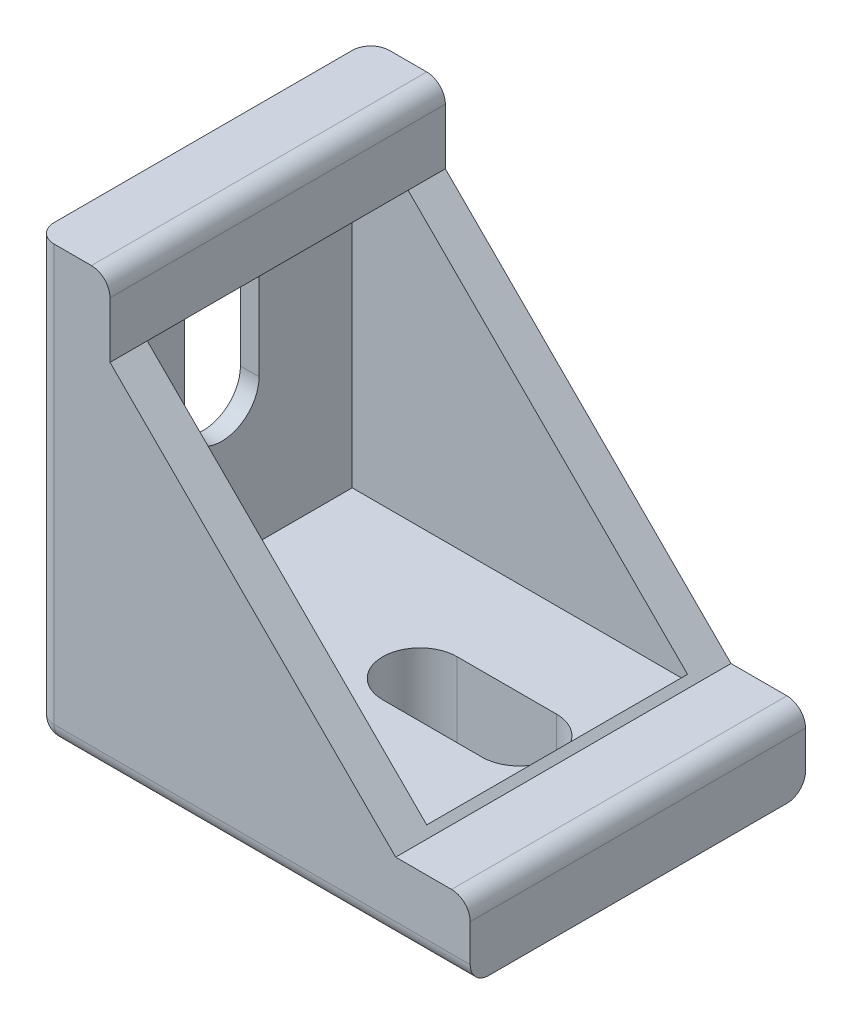
ISO-10303-21;
HEADER;
FILE_DESCRIPTION(('STEP AP214'),'2;1');
FILE_NAME('part.step','',(''),(''),'','','');
FILE_SCHEMA(('AUTOMOTIVE_DESIGN { 1 0 10303 214 1 1 1 1 }'));
ENDSEC;
DATA;
#1=APPLICATION_CONTEXT('core data for automotive mechanical design processes');
#2=APPLICATION_PROTOCOL_DEFINITION('international standard','automotive_design',2000,#1);
#3=PRODUCT_CONTEXT('',#1,'mechanical');
#4=PRODUCT('Part','Part','',(#3));
#5=PRODUCT_RELATED_PRODUCT_CATEGORY('part','',(#4));
#6=PRODUCT_DEFINITION_FORMATION('','',#4);
#7=PRODUCT_DEFINITION_CONTEXT('part definition',#1,'design');
#8=PRODUCT_DEFINITION('design','',#6,#7);
#9=PRODUCT_DEFINITION_SHAPE('','',#8);
#10=(LENGTH_UNIT() NAMED_UNIT(*) SI_UNIT(.MILLI.,.METRE.));
#11=(NAMED_UNIT(*) PLANE_ANGLE_UNIT() SI_UNIT($,.RADIAN.));
#12=(NAMED_UNIT(*) SI_UNIT($,.STERADIAN.) SOLID_ANGLE_UNIT());
#13=UNCERTAINTY_MEASURE_WITH_UNIT(LENGTH_MEASURE(1.E-05),#10,'distance_accuracy_value','');
#14=(GEOMETRIC_REPRESENTATION_CONTEXT(3) GLOBAL_UNCERTAINTY_ASSIGNED_CONTEXT((#13)) GLOBAL_UNIT_ASSIGNED_CONTEXT((#10,
#11,#12)) REPRESENTATION_CONTEXT('',''));
#15=CARTESIAN_POINT('',(0.,0.,0.));
#16=DIRECTION('',(0.,0.,1.));
#17=DIRECTION('',(1.,0.,0.));
#18=AXIS2_PLACEMENT_3D('',#15,#16,#17);
#19=CARTESIAN_POINT('',(17.5,-17.5,27.));
#20=DIRECTION('',(-1.,0.,0.));
#21=DIRECTION('',(0.,0.,1.));
#22=AXIS2_PLACEMENT_3D('',#19,#20,#21);
#23=PLANE('',#22);
#24=DIRECTION('',(0.,0.,-1.));
#25=VECTOR('',#24,1.);
#26=CARTESIAN_POINT('',(17.5,-17.5,27.));
#27=LINE('',#26,#25);
#28=CARTESIAN_POINT('',(17.5,-17.5,25.5));
#29=VERTEX_POINT('',#28);
#30=CARTESIAN_POINT('',(17.5,-17.5,1.5));
#31=VERTEX_POINT('',#30);
#32=EDGE_CURVE('E321',#29,#31,#27,.T.);
#33=ORIENTED_EDGE('',*,*,#32,.T.);
#34=CARTESIAN_POINT('',(17.5,-16.,1.5));
#35=DIRECTION('',(-1.,0.,0.));
#36=DIRECTION('',(0.,0.,1.));
#37=AXIS2_PLACEMENT_3D('',#34,#35,#36);
#38=CIRCLE('',#37,1.5);
#39=CARTESIAN_POINT('',(17.5,-16.,0.));
#40=VERTEX_POINT('',#39);
#41=EDGE_CURVE('E377',#31,#40,#38,.F.);
#42=ORIENTED_EDGE('',*,*,#41,.T.);
#43=DIRECTION('',(0.,1.,0.));
#44=VECTOR('',#43,1.);
#45=CARTESIAN_POINT('',(17.5,-17.5,0.));
#46=LINE('',#45,#44);
#47=CARTESIAN_POINT('',(17.5,-13.,0.));
#48=VERTEX_POINT('',#47);
#49=EDGE_CURVE('E322',#40,#48,#46,.T.);
#50=ORIENTED_EDGE('',*,*,#49,.T.);
#51=DIRECTION('',(0.,0.,-1.));
#52=VECTOR('',#51,1.);
#53=CARTESIAN_POINT('',(17.5,-13.,27.));
#54=LINE('',#53,#52);
#55=CARTESIAN_POINT('',(17.5,-13.,27.));
#56=VERTEX_POINT('',#55);
#57=EDGE_CURVE('E356',#48,#56,#54,.F.);
#58=ORIENTED_EDGE('',*,*,#57,.T.);
#59=DIRECTION('',(0.,1.,0.));
#60=VECTOR('',#59,1.);
#61=CARTESIAN_POINT('',(17.5,-17.5,27.));
#62=LINE('',#61,#60);
#63=CARTESIAN_POINT('',(17.5,-16.,27.));
#64=VERTEX_POINT('',#63);
#65=EDGE_CURVE('E308',#64,#56,#62,.T.);
#66=ORIENTED_EDGE('',*,*,#65,.F.);
#67=CARTESIAN_POINT('',(17.5,-16.,25.5));
#68=DIRECTION('',(-1.,0.,0.));
#69=DIRECTION('',(0.,0.,1.));
#70=AXIS2_PLACEMENT_3D('',#67,#68,#69);
#71=CIRCLE('',#70,1.5);
#72=EDGE_CURVE('E375',#64,#29,#71,.F.);
#73=ORIENTED_EDGE('',*,*,#72,.T.);
#74=EDGE_LOOP('',(#33,#42,#50,#58,#66,#73));
#75=FACE_BOUND('',#74,.T.);
#76=ADVANCED_FACE('F32',(#75),#23,.F.);
#77=CARTESIAN_POINT('',(17.5,-11.5,27.));
#78=DIRECTION('',(0.,-1.,0.));
#79=DIRECTION('',(1.,0.,0.));
#80=AXIS2_PLACEMENT_3D('',#77,#78,#79);
#81=PLANE('',#80);
#82=DIRECTION('',(-1.,0.,0.));
#83=VECTOR('',#82,1.);
#84=CARTESIAN_POINT('',(17.5,-11.5,27.));
#85=LINE('',#84,#83);
#86=CARTESIAN_POINT('',(16.,-11.5,27.));
#87=VERTEX_POINT('',#86);
#88=CARTESIAN_POINT('',(11.5,-11.5,27.));
#89=VERTEX_POINT('',#88);
#90=EDGE_CURVE('E310',#87,#89,#85,.T.);
#91=ORIENTED_EDGE('',*,*,#90,.F.);
#92=DIRECTION('',(0.,0.,-1.));
#93=VECTOR('',#92,1.);
#94=CARTESIAN_POINT('',(16.,-11.5,27.));
#95=LINE('',#94,#93);
#96=CARTESIAN_POINT('',(16.,-11.5,0.));
#97=VERTEX_POINT('',#96);
#98=EDGE_CURVE('E348',#87,#97,#95,.T.);
#99=ORIENTED_EDGE('',*,*,#98,.T.);
#100=DIRECTION('',(-1.,0.,0.));
#101=VECTOR('',#100,1.);
#102=CARTESIAN_POINT('',(17.5,-11.5,0.));
#103=LINE('',#102,#101);
#104=CARTESIAN_POINT('',(11.5,-11.5,0.));
#105=VERTEX_POINT('',#104);
#106=EDGE_CURVE('E324',#97,#105,#103,.T.);
#107=ORIENTED_EDGE('',*,*,#106,.T.);
#108=DIRECTION('',(0.,0.,-1.));
#109=VECTOR('',#108,1.);
#110=CARTESIAN_POINT('',(11.5,-11.5,27.));
#111=LINE('',#110,#109);
#112=EDGE_CURVE('E344',#89,#105,#111,.T.);
#113=ORIENTED_EDGE('',*,*,#112,.F.);
#114=EDGE_LOOP('',(#91,#99,#107,#113));
#115=FACE_BOUND('',#114,.T.);
#116=ADVANCED_FACE('F526',(#115),#81,.F.);
#117=CARTESIAN_POINT('',(-11.5,11.5,27.));
#118=DIRECTION('',(-0.707106781186547,-0.707106781186548,0.));
#119=DIRECTION('',(0.707106781186548,-0.707106781186547,0.));
#120=AXIS2_PLACEMENT_3D('',#117,#118,#119);
#121=PLANE('',#120);
#122=DIRECTION('',(0.,0.,-1.));
#123=VECTOR('',#122,1.);
#124=CARTESIAN_POINT('',(11.,-11.,27.));
#125=LINE('',#124,#123);
#126=CARTESIAN_POINT('',(11.,-11.,24.));
#127=VERTEX_POINT('',#126);
#128=CARTESIAN_POINT('',(11.,-11.,3.));
#129=VERTEX_POINT('',#128);
#130=EDGE_CURVE('E265',#127,#129,#125,.T.);
#131=ORIENTED_EDGE('',*,*,#130,.F.);
#132=DIRECTION('',(-0.707106781186548,0.707106781186547,0.));
#133=VECTOR('',#132,1.);
#134=CARTESIAN_POINT('',(-11.5,11.5,24.));
#135=LINE('',#134,#133);
#136=CARTESIAN_POINT('',(-11.5,11.5,24.));
#137=VERTEX_POINT('',#136);
#138=EDGE_CURVE('E11',#127,#137,#135,.T.);
#139=ORIENTED_EDGE('',*,*,#138,.T.);
#140=DIRECTION('',(0.,0.,-1.));
#141=VECTOR('',#140,1.);
#142=CARTESIAN_POINT('',(-11.5,11.5,27.));
#143=LINE('',#142,#141);
#144=CARTESIAN_POINT('',(-11.5,11.5,27.));
#145=VERTEX_POINT('',#144);
#146=EDGE_CURVE('E341',#145,#137,#143,.T.);
#147=ORIENTED_EDGE('',*,*,#146,.F.);
#148=DIRECTION('',(-0.707106781186548,0.707106781186547,0.));
#149=VECTOR('',#148,1.);
#150=CARTESIAN_POINT('',(-11.5,11.5,27.));
#151=LINE('',#150,#149);
#152=EDGE_CURVE('E313',#89,#145,#151,.T.);
#153=ORIENTED_EDGE('',*,*,#152,.F.);
#154=ORIENTED_EDGE('',*,*,#112,.T.);
#155=DIRECTION('',(-0.707106781186548,0.707106781186547,0.));
#156=VECTOR('',#155,1.);
#157=CARTESIAN_POINT('',(-11.5,11.5,0.));
#158=LINE('',#157,#156);
#159=CARTESIAN_POINT('',(-11.5,11.5,0.));
#160=VERTEX_POINT('',#159);
#161=EDGE_CURVE('E327',#105,#160,#158,.T.);
#162=ORIENTED_EDGE('',*,*,#161,.T.);
#163=CARTESIAN_POINT('',(-11.5,11.5,3.));
#164=VERTEX_POINT('',#163);
#165=EDGE_CURVE('E340',#164,#160,#143,.T.);
#166=ORIENTED_EDGE('',*,*,#165,.F.);
#167=DIRECTION('',(0.707106781186548,-0.707106781186547,0.));
#168=VECTOR('',#167,1.);
#169=CARTESIAN_POINT('',(-11.5,11.5,3.));
#170=LINE('',#169,#168);
#171=EDGE_CURVE('E40',#164,#129,#170,.T.);
#172=ORIENTED_EDGE('',*,*,#171,.T.);
#173=EDGE_LOOP('',(#131,#139,#147,#153,#154,#162,#166,#172));
#174=FACE_BOUND('',#173,.T.);
#175=ADVANCED_FACE('F421',(#174),#121,.F.);
#176=CARTESIAN_POINT('',(-11.5,17.5,27.));
#177=DIRECTION('',(-1.,0.,0.));
#178=DIRECTION('',(0.,-1.,0.));
#179=AXIS2_PLACEMENT_3D('',#176,#177,#178);
#180=PLANE('',#179);
#181=DIRECTION('',(0.,1.,0.));
#182=VECTOR('',#181,1.);
#183=CARTESIAN_POINT('',(-11.5,17.5,0.));
#184=LINE('',#183,#182);
#185=CARTESIAN_POINT('',(-11.5,16.,0.));
#186=VERTEX_POINT('',#185);
#187=EDGE_CURVE('E330',#160,#186,#184,.T.);
#188=ORIENTED_EDGE('',*,*,#187,.T.);
#189=DIRECTION('',(0.,0.,-1.));
#190=VECTOR('',#189,1.);
#191=CARTESIAN_POINT('',(-11.5,16.,27.));
#192=LINE('',#191,#190);
#193=CARTESIAN_POINT('',(-11.5,16.,27.));
#194=VERTEX_POINT('',#193);
#195=EDGE_CURVE('E366',#186,#194,#192,.F.);
#196=ORIENTED_EDGE('',*,*,#195,.T.);
#197=DIRECTION('',(0.,1.,0.));
#198=VECTOR('',#197,1.);
#199=CARTESIAN_POINT('',(-11.5,17.5,27.));
#200=LINE('',#199,#198);
#201=EDGE_CURVE('E315',#145,#194,#200,.T.);
#202=ORIENTED_EDGE('',*,*,#201,.F.);
#203=ORIENTED_EDGE('',*,*,#146,.T.);
#204=EDGE_CURVE('E345',#137,#164,#143,.T.);
#205=ORIENTED_EDGE('',*,*,#204,.T.);
#206=ORIENTED_EDGE('',*,*,#165,.T.);
#207=EDGE_LOOP('',(#188,#196,#202,#203,#205,#206));
#208=FACE_BOUND('',#207,.T.);
#209=ADVANCED_FACE('F510',(#208),#180,.F.);
#210=CARTESIAN_POINT('',(-17.5,17.5,27.));
#211=DIRECTION('',(0.,-1.,0.));
#212=DIRECTION('',(0.,0.,-1.));
#213=AXIS2_PLACEMENT_3D('',#210,#211,#212);
#214=PLANE('',#213);
#215=DIRECTION('',(-1.,0.,0.));
#216=VECTOR('',#215,1.);
#217=CARTESIAN_POINT('',(-17.5,17.5,0.));
#218=LINE('',#217,#216);
#219=CARTESIAN_POINT('',(-13.,17.5,0.));
#220=VERTEX_POINT('',#219);
#221=CARTESIAN_POINT('',(-16.,17.5,0.));
#222=VERTEX_POINT('',#221);
#223=EDGE_CURVE('E311',#220,#222,#218,.T.);
#224=ORIENTED_EDGE('',*,*,#223,.T.);
#225=CARTESIAN_POINT('',(-16.,17.5,1.5));
#226=DIRECTION('',(0.,-1.,0.));
#227=DIRECTION('',(0.,0.,-1.));
#228=AXIS2_PLACEMENT_3D('',#225,#226,#227);
#229=CIRCLE('',#228,1.5);
#230=CARTESIAN_POINT('',(-17.5,17.5,1.5));
#231=VERTEX_POINT('',#230);
#232=EDGE_CURVE('E391',#222,#231,#229,.F.);
#233=ORIENTED_EDGE('',*,*,#232,.T.);
#234=DIRECTION('',(0.,0.,-1.));
#235=VECTOR('',#234,1.);
#236=CARTESIAN_POINT('',(-17.5,17.5,27.));
#237=LINE('',#236,#235);
#238=CARTESIAN_POINT('',(-17.5,17.5,25.5));
#239=VERTEX_POINT('',#238);
#240=EDGE_CURVE('E337',#239,#231,#237,.T.);
#241=ORIENTED_EDGE('',*,*,#240,.F.);
#242=CARTESIAN_POINT('',(-16.,17.5,25.5));
#243=DIRECTION('',(0.,-1.,0.));
#244=DIRECTION('',(0.,0.,-1.));
#245=AXIS2_PLACEMENT_3D('',#242,#243,#244);
#246=CIRCLE('',#245,1.5);
#247=CARTESIAN_POINT('',(-16.,17.5,27.));
#248=VERTEX_POINT('',#247);
#249=EDGE_CURVE('E389',#239,#248,#246,.F.);
#250=ORIENTED_EDGE('',*,*,#249,.T.);
#251=DIRECTION('',(-1.,0.,0.));
#252=VECTOR('',#251,1.);
#253=CARTESIAN_POINT('',(-17.5,17.5,27.));
#254=LINE('',#253,#252);
#255=CARTESIAN_POINT('',(-13.,17.5,27.));
#256=VERTEX_POINT('',#255);
#257=EDGE_CURVE('E318',#256,#248,#254,.T.);
#258=ORIENTED_EDGE('',*,*,#257,.F.);
#259=DIRECTION('',(0.,0.,-1.));
#260=VECTOR('',#259,1.);
#261=CARTESIAN_POINT('',(-13.,17.5,27.));
#262=LINE('',#261,#260);
#263=EDGE_CURVE('E363',#256,#220,#262,.T.);
#264=ORIENTED_EDGE('',*,*,#263,.T.);
#265=EDGE_LOOP('',(#224,#233,#241,#250,#258,#264));
#266=FACE_BOUND('',#265,.T.);
#267=ADVANCED_FACE('F499',(#266),#214,.F.);
#268=CARTESIAN_POINT('',(-17.5,17.5,27.));
#269=DIRECTION('',(1.,0.,0.));
#270=DIRECTION('',(0.,1.,0.));
#271=AXIS2_PLACEMENT_3D('',#268,#269,#270);
#272=PLANE('',#271);
#273=DIRECTION('',(0.,1.,0.));
#274=VECTOR('',#273,1.);
#275=CARTESIAN_POINT('',(-17.5,0.,16.5));
#276=LINE('',#275,#274);
#277=CARTESIAN_POINT('',(-17.5,0.,16.5));
#278=VERTEX_POINT('',#277);
#279=CARTESIAN_POINT('',(-17.5,8.,16.5));
#280=VERTEX_POINT('',#279);
#281=EDGE_CURVE('E270',#278,#280,#276,.T.);
#282=ORIENTED_EDGE('',*,*,#281,.F.);
#283=CARTESIAN_POINT('',(-17.5,0.,13.5));
#284=DIRECTION('',(-1.,0.,0.));
#285=DIRECTION('',(0.,-1.,0.));
#286=AXIS2_PLACEMENT_3D('',#283,#284,#285);
#287=CIRCLE('',#286,3.);
#288=CARTESIAN_POINT('',(-17.5,0.,10.5));
#289=VERTEX_POINT('',#288);
#290=EDGE_CURVE('E267',#289,#278,#287,.T.);
#291=ORIENTED_EDGE('',*,*,#290,.F.);
#292=DIRECTION('',(0.,-1.,0.));
#293=VECTOR('',#292,1.);
#294=CARTESIAN_POINT('',(-17.5,0.,10.5));
#295=LINE('',#294,#293);
#296=CARTESIAN_POINT('',(-17.5,8.,10.5));
#297=VERTEX_POINT('',#296);
#298=EDGE_CURVE('E276',#297,#289,#295,.T.);
#299=ORIENTED_EDGE('',*,*,#298,.F.);
#300=CARTESIAN_POINT('',(-17.5,8.,13.5));
#301=DIRECTION('',(-1.,0.,0.));
#302=DIRECTION('',(0.,-1.,0.));
#303=AXIS2_PLACEMENT_3D('',#300,#301,#302);
#304=CIRCLE('',#303,3.);
#305=EDGE_CURVE('E273',#280,#297,#304,.T.);
#306=ORIENTED_EDGE('',*,*,#305,.F.);
#307=EDGE_LOOP('',(#282,#291,#299,#306));
#308=FACE_BOUND('',#307,.T.);
#309=ORIENTED_EDGE('',*,*,#240,.T.);
#310=DIRECTION('',(0.,-1.,0.));
#311=VECTOR('',#310,1.);
#312=CARTESIAN_POINT('',(-17.5,17.5,1.5));
#313=LINE('',#312,#311);
#314=CARTESIAN_POINT('',(-17.5,-16.,1.5));
#315=VERTEX_POINT('',#314);
#316=EDGE_CURVE('E387',#231,#315,#313,.T.);
#317=ORIENTED_EDGE('',*,*,#316,.T.);
#318=DIRECTION('',(0.,0.,-1.));
#319=VECTOR('',#318,1.);
#320=CARTESIAN_POINT('',(-17.5,-16.,27.));
#321=LINE('',#320,#319);
#322=CARTESIAN_POINT('',(-17.5,-16.,25.5));
#323=VERTEX_POINT('',#322);
#324=EDGE_CURVE('E385',#315,#323,#321,.F.);
#325=ORIENTED_EDGE('',*,*,#324,.T.);
#326=DIRECTION('',(0.,-1.,0.));
#327=VECTOR('',#326,1.);
#328=CARTESIAN_POINT('',(-17.5,17.5,25.5));
#329=LINE('',#328,#327);
#330=EDGE_CURVE('E383',#323,#239,#329,.F.);
#331=ORIENTED_EDGE('',*,*,#330,.T.);
#332=EDGE_LOOP('',(#309,#317,#325,#331));
#333=FACE_BOUND('',#332,.T.);
#334=ADVANCED_FACE('F451',(#308,#333),#272,.F.);
#335=CARTESIAN_POINT('',(-17.5,-17.5,27.));
#336=DIRECTION('',(0.,1.,0.));
#337=DIRECTION('',(0.,0.,1.));
#338=AXIS2_PLACEMENT_3D('',#335,#336,#337);
#339=PLANE('',#338);
#340=DIRECTION('',(1.,0.,0.));
#341=VECTOR('',#340,1.);
#342=CARTESIAN_POINT('',(0.,-17.5,10.5506599917635));
#343=LINE('',#342,#341);
#344=CARTESIAN_POINT('',(0.,-17.5,10.5506599917635));
#345=VERTEX_POINT('',#344);
#346=CARTESIAN_POINT('',(8.,-17.5,10.5506599917635));
#347=VERTEX_POINT('',#346);
#348=EDGE_CURVE('E290',#345,#347,#343,.T.);
#349=ORIENTED_EDGE('',*,*,#348,.F.);
#350=CARTESIAN_POINT('',(0.,-17.5,13.5506599917635));
#351=DIRECTION('',(0.,-1.,0.));
#352=DIRECTION('',(0.,0.,-1.));
#353=AXIS2_PLACEMENT_3D('',#350,#351,#352);
#354=CIRCLE('',#353,3.);
#355=CARTESIAN_POINT('',(0.,-17.5,16.5506599917635));
#356=VERTEX_POINT('',#355);
#357=EDGE_CURVE('E282',#356,#345,#354,.T.);
#358=ORIENTED_EDGE('',*,*,#357,.F.);
#359=DIRECTION('',(-1.,0.,0.));
#360=VECTOR('',#359,1.);
#361=CARTESIAN_POINT('',(0.,-17.5,16.5506599917635));
#362=LINE('',#361,#360);
#363=CARTESIAN_POINT('',(8.,-17.5,16.5506599917635));
#364=VERTEX_POINT('',#363);
#365=EDGE_CURVE('E296',#364,#356,#362,.T.);
#366=ORIENTED_EDGE('',*,*,#365,.F.);
#367=CARTESIAN_POINT('',(8.,-17.5,13.5506599917635));
#368=DIRECTION('',(0.,-1.,0.));
#369=DIRECTION('',(0.,0.,-1.));
#370=AXIS2_PLACEMENT_3D('',#367,#368,#369);
#371=CIRCLE('',#370,3.);
#372=EDGE_CURVE('E293',#347,#364,#371,.T.);
#373=ORIENTED_EDGE('',*,*,#372,.F.);
#374=EDGE_LOOP('',(#349,#358,#366,#373));
#375=FACE_BOUND('',#374,.T.);
#376=DIRECTION('',(0.,0.,-1.));
#377=VECTOR('',#376,1.);
#378=CARTESIAN_POINT('',(-16.,-17.5,27.));
#379=LINE('',#378,#377);
#380=CARTESIAN_POINT('',(-16.,-17.5,25.5));
#381=VERTEX_POINT('',#380);
#382=CARTESIAN_POINT('',(-16.,-17.5,1.5));
#383=VERTEX_POINT('',#382);
#384=EDGE_CURVE('E370',#381,#383,#379,.T.);
#385=ORIENTED_EDGE('',*,*,#384,.T.);
#386=DIRECTION('',(1.,0.,0.));
#387=VECTOR('',#386,1.);
#388=CARTESIAN_POINT('',(-17.5,-17.5,1.5));
#389=LINE('',#388,#387);
#390=EDGE_CURVE('E372',#383,#31,#389,.T.);
#391=ORIENTED_EDGE('',*,*,#390,.T.);
#392=ORIENTED_EDGE('',*,*,#32,.F.);
#393=DIRECTION('',(1.,0.,0.));
#394=VECTOR('',#393,1.);
#395=CARTESIAN_POINT('',(-17.5,-17.5,25.5));
#396=LINE('',#395,#394);
#397=EDGE_CURVE('E368',#29,#381,#396,.F.);
#398=ORIENTED_EDGE('',*,*,#397,.T.);
#399=EDGE_LOOP('',(#385,#391,#392,#398));
#400=FACE_BOUND('',#399,.T.);
#401=ADVANCED_FACE('F447',(#375,#400),#339,.F.);
#402=CARTESIAN_POINT('',(0.,0.,27.));
#403=DIRECTION('',(0.,0.,1.));
#404=DIRECTION('',(1.,0.,0.));
#405=AXIS2_PLACEMENT_3D('',#402,#403,#404);
#406=PLANE('',#405);
#407=DIRECTION('',(0.,-1.,0.));
#408=VECTOR('',#407,1.);
#409=CARTESIAN_POINT('',(-16.,-17.5,27.));
#410=LINE('',#409,#408);
#411=CARTESIAN_POINT('',(-16.,-16.,27.));
#412=VERTEX_POINT('',#411);
#413=EDGE_CURVE('E393',#248,#412,#410,.T.);
#414=ORIENTED_EDGE('',*,*,#413,.T.);
#415=DIRECTION('',(1.,0.,0.));
#416=VECTOR('',#415,1.);
#417=CARTESIAN_POINT('',(17.5,-16.,27.));
#418=LINE('',#417,#416);
#419=EDGE_CURVE('E395',#412,#64,#418,.T.);
#420=ORIENTED_EDGE('',*,*,#419,.T.);
#421=ORIENTED_EDGE('',*,*,#65,.T.);
#422=CARTESIAN_POINT('',(16.,-13.,27.));
#423=DIRECTION('',(0.,0.,1.));
#424=DIRECTION('',(1.,0.,0.));
#425=AXIS2_PLACEMENT_3D('',#422,#423,#424);
#426=CIRCLE('',#425,1.5);
#427=EDGE_CURVE('E361',#56,#87,#426,.T.);
#428=ORIENTED_EDGE('',*,*,#427,.T.);
#429=ORIENTED_EDGE('',*,*,#90,.T.);
#430=ORIENTED_EDGE('',*,*,#152,.T.);
#431=ORIENTED_EDGE('',*,*,#201,.T.);
#432=CARTESIAN_POINT('',(-13.,16.,27.));
#433=DIRECTION('',(0.,0.,1.));
#434=DIRECTION('',(1.,0.,0.));
#435=AXIS2_PLACEMENT_3D('',#432,#433,#434);
#436=CIRCLE('',#435,1.5);
#437=EDGE_CURVE('E359',#194,#256,#436,.T.);
#438=ORIENTED_EDGE('',*,*,#437,.T.);
#439=ORIENTED_EDGE('',*,*,#257,.T.);
#440=EDGE_LOOP('',(#414,#420,#421,#428,#429,#430,#431,#438,#439));
#441=FACE_BOUND('',#440,.T.);
#442=ADVANCED_FACE('F450',(#441),#406,.T.);
#443=CARTESIAN_POINT('',(0.,0.,0.));
#444=DIRECTION('',(0.,0.,1.));
#445=DIRECTION('',(1.,0.,0.));
#446=AXIS2_PLACEMENT_3D('',#443,#444,#445);
#447=PLANE('',#446);
#448=ORIENTED_EDGE('',*,*,#49,.F.);
#449=DIRECTION('',(1.,0.,0.));
#450=VECTOR('',#449,1.);
#451=CARTESIAN_POINT('',(0.,-16.,0.));
#452=LINE('',#451,#450);
#453=CARTESIAN_POINT('',(-16.,-16.,0.));
#454=VERTEX_POINT('',#453);
#455=EDGE_CURVE('E381',#40,#454,#452,.F.);
#456=ORIENTED_EDGE('',*,*,#455,.T.);
#457=DIRECTION('',(0.,-1.,0.));
#458=VECTOR('',#457,1.);
#459=CARTESIAN_POINT('',(-16.,0.,0.));
#460=LINE('',#459,#458);
#461=EDGE_CURVE('E379',#454,#222,#460,.F.);
#462=ORIENTED_EDGE('',*,*,#461,.T.);
#463=ORIENTED_EDGE('',*,*,#223,.F.);
#464=CARTESIAN_POINT('',(-13.,16.,0.));
#465=DIRECTION('',(0.,0.,1.));
#466=DIRECTION('',(1.,0.,0.));
#467=AXIS2_PLACEMENT_3D('',#464,#465,#466);
#468=CIRCLE('',#467,1.5);
#469=EDGE_CURVE('E351',#220,#186,#468,.F.);
#470=ORIENTED_EDGE('',*,*,#469,.T.);
#471=ORIENTED_EDGE('',*,*,#187,.F.);
#472=ORIENTED_EDGE('',*,*,#161,.F.);
#473=ORIENTED_EDGE('',*,*,#106,.F.);
#474=CARTESIAN_POINT('',(16.,-13.,0.));
#475=DIRECTION('',(0.,0.,1.));
#476=DIRECTION('',(1.,0.,0.));
#477=AXIS2_PLACEMENT_3D('',#474,#475,#476);
#478=CIRCLE('',#477,1.5);
#479=EDGE_CURVE('E353',#97,#48,#478,.F.);
#480=ORIENTED_EDGE('',*,*,#479,.T.);
#481=EDGE_LOOP('',(#448,#456,#462,#463,#470,#471,#472,#473,#480));
#482=FACE_BOUND('',#481,.T.);
#483=ADVANCED_FACE('F472',(#482),#447,.F.);
#484=CARTESIAN_POINT('',(16.,-13.,27.));
#485=DIRECTION('',(0.,0.,-1.));
#486=DIRECTION('',(-1.,0.,0.));
#487=AXIS2_PLACEMENT_3D('',#484,#485,#486);
#488=CYLINDRICAL_SURFACE('',#487,1.5);
#489=ORIENTED_EDGE('',*,*,#427,.F.);
#490=ORIENTED_EDGE('',*,*,#57,.F.);
#491=ORIENTED_EDGE('',*,*,#479,.F.);
#492=ORIENTED_EDGE('',*,*,#98,.F.);
#493=EDGE_LOOP('',(#489,#490,#491,#492));
#494=FACE_BOUND('',#493,.T.);
#495=ADVANCED_FACE('F480',(#494),#488,.T.);
#496=CARTESIAN_POINT('',(-13.,16.,27.));
#497=DIRECTION('',(0.,0.,-1.));
#498=DIRECTION('',(-1.,0.,0.));
#499=AXIS2_PLACEMENT_3D('',#496,#497,#498);
#500=CYLINDRICAL_SURFACE('',#499,1.5);
#501=ORIENTED_EDGE('',*,*,#437,.F.);
#502=ORIENTED_EDGE('',*,*,#195,.F.);
#503=ORIENTED_EDGE('',*,*,#469,.F.);
#504=ORIENTED_EDGE('',*,*,#263,.F.);
#505=EDGE_LOOP('',(#501,#502,#503,#504));
#506=FACE_BOUND('',#505,.T.);
#507=ADVANCED_FACE('F513',(#506),#500,.T.);
#508=CARTESIAN_POINT('',(-16.,0.,25.5));
#509=DIRECTION('',(0.,1.,0.));
#510=DIRECTION('',(-1.,0.,0.));
#511=AXIS2_PLACEMENT_3D('',#508,#509,#510);
#512=CYLINDRICAL_SURFACE('',#511,1.5);
#513=ORIENTED_EDGE('',*,*,#249,.F.);
#514=ORIENTED_EDGE('',*,*,#330,.F.);
#515=CARTESIAN_POINT('',(-16.,-16.,25.5));
#516=DIRECTION('',(0.,-1.,0.));
#517=DIRECTION('',(0.,0.,-1.));
#518=AXIS2_PLACEMENT_3D('',#515,#516,#517);
#519=CIRCLE('',#518,1.5);
#520=EDGE_CURVE('E325',#412,#323,#519,.T.);
#521=ORIENTED_EDGE('',*,*,#520,.F.);
#522=ORIENTED_EDGE('',*,*,#413,.F.);
#523=EDGE_LOOP('',(#513,#514,#521,#522));
#524=FACE_BOUND('',#523,.T.);
#525=ADVANCED_FACE('F34',(#524),#512,.T.);
#526=CARTESIAN_POINT('',(0.,-16.,25.5));
#527=DIRECTION('',(-1.,0.,0.));
#528=DIRECTION('',(0.,0.,1.));
#529=AXIS2_PLACEMENT_3D('',#526,#527,#528);
#530=CYLINDRICAL_SURFACE('',#529,1.5);
#531=ORIENTED_EDGE('',*,*,#72,.F.);
#532=ORIENTED_EDGE('',*,*,#419,.F.);
#533=CARTESIAN_POINT('',(-16.,-16.,25.5));
#534=DIRECTION('',(-1.,0.,0.));
#535=DIRECTION('',(0.,0.,1.));
#536=AXIS2_PLACEMENT_3D('',#533,#534,#535);
#537=CIRCLE('',#536,1.5);
#538=EDGE_CURVE('E409',#381,#412,#537,.T.);
#539=ORIENTED_EDGE('',*,*,#538,.F.);
#540=ORIENTED_EDGE('',*,*,#397,.F.);
#541=EDGE_LOOP('',(#531,#532,#539,#540));
#542=FACE_BOUND('',#541,.T.);
#543=ADVANCED_FACE('F486',(#542),#530,.T.);
#544=CARTESIAN_POINT('',(-16.,-16.,25.5));
#545=DIRECTION('',(0.,0.,1.));
#546=DIRECTION('',(1.,0.,0.));
#547=AXIS2_PLACEMENT_3D('',#544,#545,#546);
#548=SPHERICAL_SURFACE('',#547,1.5);
#549=ORIENTED_EDGE('',*,*,#538,.T.);
#550=ORIENTED_EDGE('',*,*,#520,.T.);
#551=CARTESIAN_POINT('',(-16.,-16.,25.5));
#552=DIRECTION('',(0.,0.,1.));
#553=DIRECTION('',(1.,0.,0.));
#554=AXIS2_PLACEMENT_3D('',#551,#552,#553);
#555=CIRCLE('',#554,1.5);
#556=EDGE_CURVE('E406',#381,#323,#555,.F.);
#557=ORIENTED_EDGE('',*,*,#556,.F.);
#558=EDGE_LOOP('',(#549,#550,#557));
#559=FACE_BOUND('',#558,.T.);
#560=ADVANCED_FACE('F490',(#559),#548,.T.);
#561=CARTESIAN_POINT('',(-16.,17.5,1.5));
#562=DIRECTION('',(0.,-1.,0.));
#563=DIRECTION('',(1.,0.,0.));
#564=AXIS2_PLACEMENT_3D('',#561,#562,#563);
#565=CYLINDRICAL_SURFACE('',#564,1.5);
#566=ORIENTED_EDGE('',*,*,#232,.F.);
#567=ORIENTED_EDGE('',*,*,#461,.F.);
#568=CARTESIAN_POINT('',(-16.,-16.,1.5));
#569=DIRECTION('',(0.,-1.,0.));
#570=DIRECTION('',(0.,0.,-1.));
#571=AXIS2_PLACEMENT_3D('',#568,#569,#570);
#572=CIRCLE('',#571,1.5);
#573=EDGE_CURVE('E403',#315,#454,#572,.T.);
#574=ORIENTED_EDGE('',*,*,#573,.F.);
#575=ORIENTED_EDGE('',*,*,#316,.F.);
#576=EDGE_LOOP('',(#566,#567,#574,#575));
#577=FACE_BOUND('',#576,.T.);
#578=ADVANCED_FACE('F504',(#577),#565,.T.);
#579=CARTESIAN_POINT('',(-16.,-16.,27.));
#580=DIRECTION('',(0.,0.,-1.));
#581=DIRECTION('',(-1.,0.,0.));
#582=AXIS2_PLACEMENT_3D('',#579,#580,#581);
#583=CYLINDRICAL_SURFACE('',#582,1.5);
#584=ORIENTED_EDGE('',*,*,#556,.T.);
#585=ORIENTED_EDGE('',*,*,#324,.F.);
#586=CARTESIAN_POINT('',(-16.,-16.,1.5));
#587=DIRECTION('',(0.,0.,-1.));
#588=DIRECTION('',(-1.,0.,0.));
#589=AXIS2_PLACEMENT_3D('',#586,#587,#588);
#590=CIRCLE('',#589,1.5);
#591=EDGE_CURVE('E400',#383,#315,#590,.T.);
#592=ORIENTED_EDGE('',*,*,#591,.F.);
#593=ORIENTED_EDGE('',*,*,#384,.F.);
#594=EDGE_LOOP('',(#584,#585,#592,#593));
#595=FACE_BOUND('',#594,.T.);
#596=ADVANCED_FACE('F462',(#595),#583,.T.);
#597=CARTESIAN_POINT('',(-16.,-16.,1.5));
#598=DIRECTION('',(0.,0.,1.));
#599=DIRECTION('',(1.,0.,0.));
#600=AXIS2_PLACEMENT_3D('',#597,#598,#599);
#601=SPHERICAL_SURFACE('',#600,1.5);
#602=ORIENTED_EDGE('',*,*,#591,.T.);
#603=ORIENTED_EDGE('',*,*,#573,.T.);
#604=CARTESIAN_POINT('',(-16.,-16.,1.5));
#605=DIRECTION('',(-1.,0.,0.));
#606=DIRECTION('',(0.,0.,1.));
#607=AXIS2_PLACEMENT_3D('',#604,#605,#606);
#608=CIRCLE('',#607,1.5);
#609=EDGE_CURVE('E302',#383,#454,#608,.F.);
#610=ORIENTED_EDGE('',*,*,#609,.F.);
#611=EDGE_LOOP('',(#602,#603,#610));
#612=FACE_BOUND('',#611,.T.);
#613=ADVANCED_FACE('F465',(#612),#601,.T.);
#614=CARTESIAN_POINT('',(-17.5,-16.,1.5));
#615=DIRECTION('',(1.,0.,0.));
#616=DIRECTION('',(0.,0.,-1.));
#617=AXIS2_PLACEMENT_3D('',#614,#615,#616);
#618=CYLINDRICAL_SURFACE('',#617,1.5);
#619=ORIENTED_EDGE('',*,*,#609,.T.);
#620=ORIENTED_EDGE('',*,*,#455,.F.);
#621=ORIENTED_EDGE('',*,*,#41,.F.);
#622=ORIENTED_EDGE('',*,*,#390,.F.);
#623=EDGE_LOOP('',(#619,#620,#621,#622));
#624=FACE_BOUND('',#623,.T.);
#625=ADVANCED_FACE('F468',(#624),#618,.T.);
#626=CARTESIAN_POINT('',(0.,9.5,13.5506599917635));
#627=DIRECTION('',(0.,-1.,0.));
#628=DIRECTION('',(0.,0.,-1.));
#629=AXIS2_PLACEMENT_3D('',#626,#627,#628);
#630=CYLINDRICAL_SURFACE('',#629,3.);
#631=DIRECTION('',(0.,-1.,0.));
#632=VECTOR('',#631,1.);
#633=CARTESIAN_POINT('',(0.,9.5,10.5506599917635));
#634=LINE('',#633,#632);
#635=CARTESIAN_POINT('',(0.,-11.5,10.5506599917635));
#636=VERTEX_POINT('',#635);
#637=EDGE_CURVE('E299',#636,#345,#634,.T.);
#638=ORIENTED_EDGE('',*,*,#637,.F.);
#639=CARTESIAN_POINT('',(0.,-11.5,13.5506599917635));
#640=DIRECTION('',(0.,-1.,0.));
#641=DIRECTION('',(0.,0.,-1.));
#642=AXIS2_PLACEMENT_3D('',#639,#640,#641);
#643=CIRCLE('',#642,3.);
#644=CARTESIAN_POINT('',(0.,-11.5,16.5506599917635));
#645=VERTEX_POINT('',#644);
#646=EDGE_CURVE('E55',#636,#645,#643,.F.);
#647=ORIENTED_EDGE('',*,*,#646,.T.);
#648=DIRECTION('',(0.,-1.,0.));
#649=VECTOR('',#648,1.);
#650=CARTESIAN_POINT('',(0.,9.5,16.5506599917635));
#651=LINE('',#650,#649);
#652=EDGE_CURVE('E300',#645,#356,#651,.T.);
#653=ORIENTED_EDGE('',*,*,#652,.T.);
#654=ORIENTED_EDGE('',*,*,#357,.T.);
#655=EDGE_LOOP('',(#638,#647,#653,#654));
#656=FACE_BOUND('',#655,.T.);
#657=ADVANCED_FACE('F442',(#656),#630,.F.);
#658=CARTESIAN_POINT('',(0.,9.5,16.5506599917635));
#659=DIRECTION('',(0.,0.,1.));
#660=DIRECTION('',(1.,0.,0.));
#661=AXIS2_PLACEMENT_3D('',#658,#659,#660);
#662=PLANE('',#661);
#663=ORIENTED_EDGE('',*,*,#652,.F.);
#664=DIRECTION('',(1.,0.,0.));
#665=VECTOR('',#664,1.);
#666=CARTESIAN_POINT('',(0.,-11.5,16.5506599917635));
#667=LINE('',#666,#665);
#668=CARTESIAN_POINT('',(8.,-11.5,16.5506599917635));
#669=VERTEX_POINT('',#668);
#670=EDGE_CURVE('E262',#645,#669,#667,.T.);
#671=ORIENTED_EDGE('',*,*,#670,.T.);
#672=DIRECTION('',(0.,-1.,0.));
#673=VECTOR('',#672,1.);
#674=CARTESIAN_POINT('',(8.,9.5,16.5506599917635));
#675=LINE('',#674,#673);
#676=EDGE_CURVE('E303',#669,#364,#675,.T.);
#677=ORIENTED_EDGE('',*,*,#676,.T.);
#678=ORIENTED_EDGE('',*,*,#365,.T.);
#679=EDGE_LOOP('',(#663,#671,#677,#678));
#680=FACE_BOUND('',#679,.T.);
#681=ADVANCED_FACE('F438',(#680),#662,.F.);
#682=CARTESIAN_POINT('',(8.,9.5,13.5506599917635));
#683=DIRECTION('',(0.,-1.,0.));
#684=DIRECTION('',(0.,0.,-1.));
#685=AXIS2_PLACEMENT_3D('',#682,#683,#684);
#686=CYLINDRICAL_SURFACE('',#685,3.);
#687=CARTESIAN_POINT('',(8.,-11.5,13.5506599917635));
#688=DIRECTION('',(0.,-1.,0.));
#689=DIRECTION('',(0.,0.,-1.));
#690=AXIS2_PLACEMENT_3D('',#687,#688,#689);
#691=CIRCLE('',#690,3.);
#692=CARTESIAN_POINT('',(11.,-11.5,13.5506599917635));
#693=VERTEX_POINT('',#692);
#694=EDGE_CURVE('E260',#669,#693,#691,.F.);
#695=ORIENTED_EDGE('',*,*,#694,.T.);
#696=CARTESIAN_POINT('',(8.,-11.5,10.5506599917635));
#697=VERTEX_POINT('',#696);
#698=EDGE_CURVE('E257',#693,#697,#691,.F.);
#699=ORIENTED_EDGE('',*,*,#698,.T.);
#700=DIRECTION('',(0.,-1.,0.));
#701=VECTOR('',#700,1.);
#702=CARTESIAN_POINT('',(8.,9.5,10.5506599917635));
#703=LINE('',#702,#701);
#704=EDGE_CURVE('E305',#697,#347,#703,.T.);
#705=ORIENTED_EDGE('',*,*,#704,.T.);
#706=ORIENTED_EDGE('',*,*,#372,.T.);
#707=ORIENTED_EDGE('',*,*,#676,.F.);
#708=EDGE_LOOP('',(#695,#699,#705,#706,#707));
#709=FACE_BOUND('',#708,.T.);
#710=ADVANCED_FACE('F432',(#709),#686,.F.);
#711=CARTESIAN_POINT('',(0.,9.5,10.5506599917635));
#712=DIRECTION('',(0.,0.,-1.));
#713=DIRECTION('',(-1.,0.,0.));
#714=AXIS2_PLACEMENT_3D('',#711,#712,#713);
#715=PLANE('',#714);
#716=ORIENTED_EDGE('',*,*,#704,.F.);
#717=DIRECTION('',(-1.,0.,0.));
#718=VECTOR('',#717,1.);
#719=CARTESIAN_POINT('',(0.,-11.5,10.5506599917635));
#720=LINE('',#719,#718);
#721=EDGE_CURVE('E416',#697,#636,#720,.T.);
#722=ORIENTED_EDGE('',*,*,#721,.T.);
#723=ORIENTED_EDGE('',*,*,#637,.T.);
#724=ORIENTED_EDGE('',*,*,#348,.T.);
#725=EDGE_LOOP('',(#716,#722,#723,#724));
#726=FACE_BOUND('',#725,.T.);
#727=ADVANCED_FACE('F445',(#726),#715,.F.);
#728=CARTESIAN_POINT('',(9.49999999999999,0.,10.5));
#729=DIRECTION('',(0.,0.,-1.));
#730=DIRECTION('',(-1.,0.,0.));
#731=AXIS2_PLACEMENT_3D('',#728,#729,#730);
#732=PLANE('',#731);
#733=DIRECTION('',(-1.,0.,0.));
#734=VECTOR('',#733,1.);
#735=CARTESIAN_POINT('',(9.49999999999999,0.,10.5));
#736=LINE('',#735,#734);
#737=CARTESIAN_POINT('',(-16.,0.,10.5));
#738=VERTEX_POINT('',#737);
#739=EDGE_CURVE('E280',#738,#289,#736,.T.);
#740=ORIENTED_EDGE('',*,*,#739,.F.);
#741=DIRECTION('',(0.,1.,0.));
#742=VECTOR('',#741,1.);
#743=CARTESIAN_POINT('',(-16.,0.,10.5));
#744=LINE('',#743,#742);
#745=CARTESIAN_POINT('',(-16.,8.,10.5));
#746=VERTEX_POINT('',#745);
#747=EDGE_CURVE('E254',#738,#746,#744,.T.);
#748=ORIENTED_EDGE('',*,*,#747,.T.);
#749=DIRECTION('',(-1.,0.,0.));
#750=VECTOR('',#749,1.);
#751=CARTESIAN_POINT('',(9.49999999999999,8.,10.5));
#752=LINE('',#751,#750);
#753=EDGE_CURVE('E283',#746,#297,#752,.T.);
#754=ORIENTED_EDGE('',*,*,#753,.T.);
#755=ORIENTED_EDGE('',*,*,#298,.T.);
#756=EDGE_LOOP('',(#740,#748,#754,#755));
#757=FACE_BOUND('',#756,.T.);
#758=ADVANCED_FACE('F689',(#757),#732,.F.);
#759=CARTESIAN_POINT('',(9.49999999999999,8.,13.5));
#760=DIRECTION('',(-1.,0.,0.));
#761=DIRECTION('',(0.,-1.,0.));
#762=AXIS2_PLACEMENT_3D('',#759,#760,#761);
#763=CYLINDRICAL_SURFACE('',#762,3.);
#764=ORIENTED_EDGE('',*,*,#753,.F.);
#765=CARTESIAN_POINT('',(-16.,8.,13.5));
#766=DIRECTION('',(-1.,0.,0.));
#767=DIRECTION('',(0.,0.,1.));
#768=AXIS2_PLACEMENT_3D('',#765,#766,#767);
#769=CIRCLE('',#768,3.);
#770=CARTESIAN_POINT('',(-16.,8.,16.5));
#771=VERTEX_POINT('',#770);
#772=EDGE_CURVE('E251',#746,#771,#769,.F.);
#773=ORIENTED_EDGE('',*,*,#772,.T.);
#774=DIRECTION('',(-1.,0.,0.));
#775=VECTOR('',#774,1.);
#776=CARTESIAN_POINT('',(9.49999999999999,8.,16.5));
#777=LINE('',#776,#775);
#778=EDGE_CURVE('E285',#771,#280,#777,.T.);
#779=ORIENTED_EDGE('',*,*,#778,.T.);
#780=ORIENTED_EDGE('',*,*,#305,.T.);
#781=EDGE_LOOP('',(#764,#773,#779,#780));
#782=FACE_BOUND('',#781,.T.);
#783=ADVANCED_FACE('F697',(#782),#763,.F.);
#784=CARTESIAN_POINT('',(9.49999999999999,0.,16.5));
#785=DIRECTION('',(0.,0.,1.));
#786=DIRECTION('',(1.,0.,0.));
#787=AXIS2_PLACEMENT_3D('',#784,#785,#786);
#788=PLANE('',#787);
#789=ORIENTED_EDGE('',*,*,#778,.F.);
#790=DIRECTION('',(0.,-1.,0.));
#791=VECTOR('',#790,1.);
#792=CARTESIAN_POINT('',(-16.,0.,16.5));
#793=LINE('',#792,#791);
#794=CARTESIAN_POINT('',(-16.,0.,16.5));
#795=VERTEX_POINT('',#794);
#796=EDGE_CURVE('E246',#771,#795,#793,.T.);
#797=ORIENTED_EDGE('',*,*,#796,.T.);
#798=DIRECTION('',(-1.,0.,0.));
#799=VECTOR('',#798,1.);
#800=CARTESIAN_POINT('',(9.49999999999999,0.,16.5));
#801=LINE('',#800,#799);
#802=EDGE_CURVE('E279',#795,#278,#801,.T.);
#803=ORIENTED_EDGE('',*,*,#802,.T.);
#804=ORIENTED_EDGE('',*,*,#281,.T.);
#805=EDGE_LOOP('',(#789,#797,#803,#804));
#806=FACE_BOUND('',#805,.T.);
#807=ADVANCED_FACE('F706',(#806),#788,.F.);
#808=CARTESIAN_POINT('',(9.49999999999999,0.,13.5));
#809=DIRECTION('',(-1.,0.,0.));
#810=DIRECTION('',(0.,-1.,0.));
#811=AXIS2_PLACEMENT_3D('',#808,#809,#810);
#812=CYLINDRICAL_SURFACE('',#811,3.);
#813=ORIENTED_EDGE('',*,*,#802,.F.);
#814=CARTESIAN_POINT('',(-16.,0.,13.5));
#815=DIRECTION('',(-1.,0.,0.));
#816=DIRECTION('',(0.,0.,1.));
#817=AXIS2_PLACEMENT_3D('',#814,#815,#816);
#818=CIRCLE('',#817,3.);
#819=EDGE_CURVE('E397',#795,#738,#818,.F.);
#820=ORIENTED_EDGE('',*,*,#819,.T.);
#821=ORIENTED_EDGE('',*,*,#739,.T.);
#822=ORIENTED_EDGE('',*,*,#290,.T.);
#823=EDGE_LOOP('',(#813,#820,#821,#822));
#824=FACE_BOUND('',#823,.T.);
#825=ADVANCED_FACE('F715',(#824),#812,.F.);
#826=CARTESIAN_POINT('',(-16.,-11.5,24.));
#827=DIRECTION('',(0.,0.,1.));
#828=DIRECTION('',(1.,0.,0.));
#829=AXIS2_PLACEMENT_3D('',#826,#827,#828);
#830=PLANE('',#829);
#831=DIRECTION('',(0.,-1.,0.));
#832=VECTOR('',#831,1.);
#833=CARTESIAN_POINT('',(11.,-11.5,24.));
#834=LINE('',#833,#832);
#835=CARTESIAN_POINT('',(11.,-11.5,24.));
#836=VERTEX_POINT('',#835);
#837=EDGE_CURVE('E216',#127,#836,#834,.T.);
#838=ORIENTED_EDGE('',*,*,#837,.T.);
#839=DIRECTION('',(1.,0.,0.));
#840=VECTOR('',#839,1.);
#841=CARTESIAN_POINT('',(-16.,-11.5,24.));
#842=LINE('',#841,#840);
#843=CARTESIAN_POINT('',(-16.,-11.5,24.));
#844=VERTEX_POINT('',#843);
#845=EDGE_CURVE('E208',#844,#836,#842,.T.);
#846=ORIENTED_EDGE('',*,*,#845,.F.);
#847=DIRECTION('',(0.,-1.,0.));
#848=VECTOR('',#847,1.);
#849=CARTESIAN_POINT('',(-16.,-11.5,24.));
#850=LINE('',#849,#848);
#851=CARTESIAN_POINT('',(-16.,11.5,24.));
#852=VERTEX_POINT('',#851);
#853=EDGE_CURVE('E213',#852,#844,#850,.T.);
#854=ORIENTED_EDGE('',*,*,#853,.F.);
#855=DIRECTION('',(1.,0.,0.));
#856=VECTOR('',#855,1.);
#857=CARTESIAN_POINT('',(-16.,11.5,24.));
#858=LINE('',#857,#856);
#859=EDGE_CURVE('E244',#852,#137,#858,.T.);
#860=ORIENTED_EDGE('',*,*,#859,.T.);
#861=ORIENTED_EDGE('',*,*,#138,.F.);
#862=EDGE_LOOP('',(#838,#846,#854,#860,#861));
#863=FACE_BOUND('',#862,.T.);
#864=ADVANCED_FACE('F210',(#863),#830,.F.);
#865=CARTESIAN_POINT('',(-16.,-11.5,3.));
#866=DIRECTION('',(0.,0.,-1.));
#867=DIRECTION('',(-1.,0.,0.));
#868=AXIS2_PLACEMENT_3D('',#865,#866,#867);
#869=PLANE('',#868);
#870=DIRECTION('',(1.,0.,0.));
#871=VECTOR('',#870,1.);
#872=CARTESIAN_POINT('',(-16.,11.5,3.));
#873=LINE('',#872,#871);
#874=CARTESIAN_POINT('',(-16.,11.5,3.));
#875=VERTEX_POINT('',#874);
#876=EDGE_CURVE('E47',#875,#164,#873,.T.);
#877=ORIENTED_EDGE('',*,*,#876,.F.);
#878=DIRECTION('',(0.,1.,0.));
#879=VECTOR('',#878,1.);
#880=CARTESIAN_POINT('',(-16.,-11.5,3.));
#881=LINE('',#880,#879);
#882=CARTESIAN_POINT('',(-16.,-11.5,3.));
#883=VERTEX_POINT('',#882);
#884=EDGE_CURVE('E229',#883,#875,#881,.T.);
#885=ORIENTED_EDGE('',*,*,#884,.F.);
#886=DIRECTION('',(1.,0.,0.));
#887=VECTOR('',#886,1.);
#888=CARTESIAN_POINT('',(-16.,-11.5,3.));
#889=LINE('',#888,#887);
#890=CARTESIAN_POINT('',(11.,-11.5,3.));
#891=VERTEX_POINT('',#890);
#892=EDGE_CURVE('E219',#883,#891,#889,.T.);
#893=ORIENTED_EDGE('',*,*,#892,.T.);
#894=DIRECTION('',(0.,1.,0.));
#895=VECTOR('',#894,1.);
#896=CARTESIAN_POINT('',(11.,-11.5,3.));
#897=LINE('',#896,#895);
#898=EDGE_CURVE('E233',#891,#129,#897,.T.);
#899=ORIENTED_EDGE('',*,*,#898,.T.);
#900=ORIENTED_EDGE('',*,*,#171,.F.);
#901=EDGE_LOOP('',(#877,#885,#893,#899,#900));
#902=FACE_BOUND('',#901,.T.);
#903=ADVANCED_FACE('F424',(#902),#869,.F.);
#904=CARTESIAN_POINT('',(-16.,11.5,24.));
#905=DIRECTION('',(0.,1.,0.));
#906=DIRECTION('',(0.,0.,1.));
#907=AXIS2_PLACEMENT_3D('',#904,#905,#906);
#908=PLANE('',#907);
#909=ORIENTED_EDGE('',*,*,#859,.F.);
#910=DIRECTION('',(0.,0.,1.));
#911=VECTOR('',#910,1.);
#912=CARTESIAN_POINT('',(-16.,11.5,24.));
#913=LINE('',#912,#911);
#914=EDGE_CURVE('E220',#875,#852,#913,.T.);
#915=ORIENTED_EDGE('',*,*,#914,.F.);
#916=ORIENTED_EDGE('',*,*,#876,.T.);
#917=ORIENTED_EDGE('',*,*,#204,.F.);
#918=EDGE_LOOP('',(#909,#915,#916,#917));
#919=FACE_BOUND('',#918,.T.);
#920=ADVANCED_FACE('F516',(#919),#908,.F.);
#921=CARTESIAN_POINT('',(11.,0.,0.));
#922=DIRECTION('',(-1.,0.,0.));
#923=DIRECTION('',(0.,0.,1.));
#924=AXIS2_PLACEMENT_3D('',#921,#922,#923);
#925=PLANE('',#924);
#926=ORIENTED_EDGE('',*,*,#130,.T.);
#927=ORIENTED_EDGE('',*,*,#898,.F.);
#928=DIRECTION('',(0.,0.,-1.));
#929=VECTOR('',#928,1.);
#930=CARTESIAN_POINT('',(11.,-11.5,24.));
#931=LINE('',#930,#929);
#932=EDGE_CURVE('E242',#693,#891,#931,.T.);
#933=ORIENTED_EDGE('',*,*,#932,.F.);
#934=EDGE_CURVE('E236',#836,#693,#931,.T.);
#935=ORIENTED_EDGE('',*,*,#934,.F.);
#936=ORIENTED_EDGE('',*,*,#837,.F.);
#937=EDGE_LOOP('',(#926,#927,#933,#935,#936));
#938=FACE_BOUND('',#937,.T.);
#939=ADVANCED_FACE('F428',(#938),#925,.T.);
#940=CARTESIAN_POINT('',(-16.,-11.5,24.));
#941=DIRECTION('',(0.,-1.,0.));
#942=DIRECTION('',(0.,0.,-1.));
#943=AXIS2_PLACEMENT_3D('',#940,#941,#942);
#944=PLANE('',#943);
#945=ORIENTED_EDGE('',*,*,#646,.F.);
#946=ORIENTED_EDGE('',*,*,#721,.F.);
#947=ORIENTED_EDGE('',*,*,#698,.F.);
#948=ORIENTED_EDGE('',*,*,#932,.T.);
#949=ORIENTED_EDGE('',*,*,#892,.F.);
#950=DIRECTION('',(0.,0.,-1.));
#951=VECTOR('',#950,1.);
#952=CARTESIAN_POINT('',(-16.,-11.5,24.));
#953=LINE('',#952,#951);
#954=EDGE_CURVE('E223',#844,#883,#953,.T.);
#955=ORIENTED_EDGE('',*,*,#954,.F.);
#956=ORIENTED_EDGE('',*,*,#845,.T.);
#957=ORIENTED_EDGE('',*,*,#934,.T.);
#958=ORIENTED_EDGE('',*,*,#694,.F.);
#959=ORIENTED_EDGE('',*,*,#670,.F.);
#960=EDGE_LOOP('',(#945,#946,#947,#948,#949,#955,#956,#957,#958,#959));
#961=FACE_BOUND('',#960,.T.);
#962=ADVANCED_FACE('F224',(#961),#944,.F.);
#963=CARTESIAN_POINT('',(-16.,0.,0.));
#964=DIRECTION('',(-1.,0.,0.));
#965=DIRECTION('',(0.,0.,1.));
#966=AXIS2_PLACEMENT_3D('',#963,#964,#965);
#967=PLANE('',#966);
#968=ORIENTED_EDGE('',*,*,#853,.T.);
#969=ORIENTED_EDGE('',*,*,#954,.T.);
#970=ORIENTED_EDGE('',*,*,#884,.T.);
#971=ORIENTED_EDGE('',*,*,#914,.T.);
#972=EDGE_LOOP('',(#968,#969,#970,#971));
#973=FACE_BOUND('',#972,.T.);
#974=ORIENTED_EDGE('',*,*,#819,.F.);
#975=ORIENTED_EDGE('',*,*,#796,.F.);
#976=ORIENTED_EDGE('',*,*,#772,.F.);
#977=ORIENTED_EDGE('',*,*,#747,.F.);
#978=EDGE_LOOP('',(#974,#975,#976,#977));
#979=FACE_BOUND('',#978,.T.);
#980=ADVANCED_FACE('F231',(#973,#979),#967,.F.);
#981=CLOSED_SHELL('',(#76,#116,#175,#209,#267,#334,#401,#442,#483,#495,#507,#525,#543,#560,#578,
#596,#613,#625,#657,#681,#710,#727,#758,#783,#807,#825,#864,#903,#920,#939,#962,#980));
#982=MANIFOLD_SOLID_BREP('B2',#981);
#983=ADVANCED_BREP_SHAPE_REPRESENTATION('',(#18,#982),#14);
#984=SHAPE_DEFINITION_REPRESENTATION(#9,#983);
ENDSEC;
END-ISO-10303-21;
